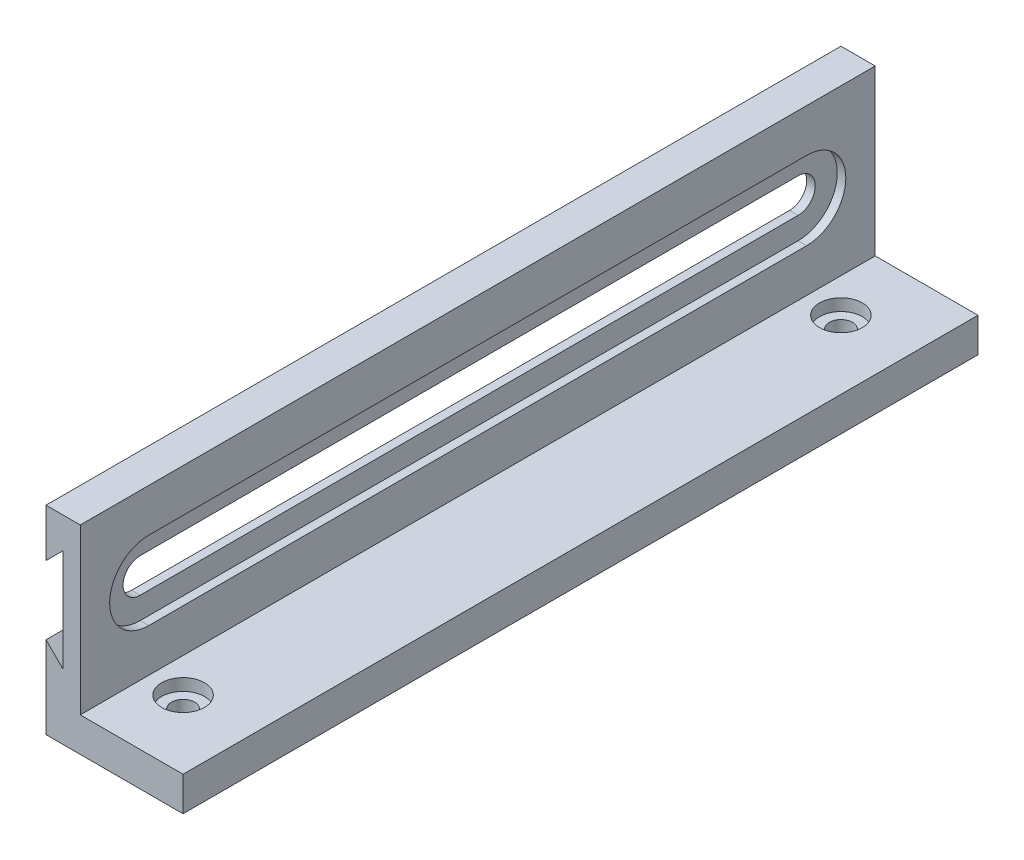
ISO-10303-21;
HEADER;
FILE_DESCRIPTION(('STEP AP214'),'2;1');
FILE_NAME('part.step','',(''),(''),'','','');
FILE_SCHEMA(('AUTOMOTIVE_DESIGN { 1 0 10303 214 1 1 1 1 }'));
ENDSEC;
DATA;
#1=APPLICATION_CONTEXT('core data for automotive mechanical design processes');
#2=APPLICATION_PROTOCOL_DEFINITION('international standard','automotive_design',2000,#1);
#3=PRODUCT_CONTEXT('',#1,'mechanical');
#4=PRODUCT('Part','Part','',(#3));
#5=PRODUCT_RELATED_PRODUCT_CATEGORY('part','',(#4));
#6=PRODUCT_DEFINITION_FORMATION('','',#4);
#7=PRODUCT_DEFINITION_CONTEXT('part definition',#1,'design');
#8=PRODUCT_DEFINITION('design','',#6,#7);
#9=PRODUCT_DEFINITION_SHAPE('','',#8);
#10=(LENGTH_UNIT() NAMED_UNIT(*) SI_UNIT(.MILLI.,.METRE.));
#11=(NAMED_UNIT(*) PLANE_ANGLE_UNIT() SI_UNIT($,.RADIAN.));
#12=(NAMED_UNIT(*) SI_UNIT($,.STERADIAN.) SOLID_ANGLE_UNIT());
#13=UNCERTAINTY_MEASURE_WITH_UNIT(LENGTH_MEASURE(1.E-05),#10,'distance_accuracy_value','');
#14=(GEOMETRIC_REPRESENTATION_CONTEXT(3) GLOBAL_UNCERTAINTY_ASSIGNED_CONTEXT((#13)) GLOBAL_UNIT_ASSIGNED_CONTEXT((#10,
#11,#12)) REPRESENTATION_CONTEXT('',''));
#15=CARTESIAN_POINT('',(0.,0.,0.));
#16=DIRECTION('',(0.,0.,1.));
#17=DIRECTION('',(1.,0.,0.));
#18=AXIS2_PLACEMENT_3D('',#15,#16,#17);
#19=CARTESIAN_POINT('',(0.,-6.35,0.));
#20=DIRECTION('',(-1.,0.,0.));
#21=DIRECTION('',(0.,0.,1.));
#22=AXIS2_PLACEMENT_3D('',#19,#20,#21);
#23=PLANE('',#22);
#24=DIRECTION('',(0.,1.,0.));
#25=VECTOR('',#24,1.);
#26=CARTESIAN_POINT('',(0.,-6.35,-147.32));
#27=LINE('',#26,#25);
#28=CARTESIAN_POINT('',(0.,21.59,-147.32));
#29=VERTEX_POINT('',#28);
#30=CARTESIAN_POINT('',(0.,30.48,-147.32));
#31=VERTEX_POINT('',#30);
#32=EDGE_CURVE('E203',#29,#31,#27,.T.);
#33=ORIENTED_EDGE('',*,*,#32,.F.);
#34=DIRECTION('',(0.,0.,-1.));
#35=VECTOR('',#34,1.);
#36=CARTESIAN_POINT('',(0.,21.59,0.));
#37=LINE('',#36,#35);
#38=CARTESIAN_POINT('',(0.,21.59,0.));
#39=VERTEX_POINT('',#38);
#40=EDGE_CURVE('E181',#39,#29,#37,.T.);
#41=ORIENTED_EDGE('',*,*,#40,.F.);
#42=DIRECTION('',(0.,1.,0.));
#43=VECTOR('',#42,1.);
#44=CARTESIAN_POINT('',(0.,-6.35,0.));
#45=LINE('',#44,#43);
#46=CARTESIAN_POINT('',(0.,30.48,0.));
#47=VERTEX_POINT('',#46);
#48=EDGE_CURVE('E196',#39,#47,#45,.T.);
#49=ORIENTED_EDGE('',*,*,#48,.T.);
#50=DIRECTION('',(0.,0.,-1.));
#51=VECTOR('',#50,1.);
#52=CARTESIAN_POINT('',(0.,30.48,0.));
#53=LINE('',#52,#51);
#54=EDGE_CURVE('E229',#47,#31,#53,.T.);
#55=ORIENTED_EDGE('',*,*,#54,.T.);
#56=EDGE_LOOP('',(#33,#41,#49,#55));
#57=FACE_BOUND('',#56,.T.);
#58=ADVANCED_FACE('F47',(#57),#23,.T.);
#59=CARTESIAN_POINT('',(0.,15.24,-12.7));
#60=DIRECTION('',(1.,0.,0.));
#61=DIRECTION('',(0.,0.,-1.));
#62=AXIS2_PLACEMENT_3D('',#59,#60,#61);
#63=CYLINDRICAL_SURFACE('',#62,3.175);
#64=DIRECTION('',(1.,0.,0.));
#65=VECTOR('',#64,1.);
#66=CARTESIAN_POINT('',(0.,12.065,-12.7));
#67=LINE('',#66,#65);
#68=CARTESIAN_POINT('',(3.17500000000001,12.065,-12.7));
#69=VERTEX_POINT('',#68);
#70=CARTESIAN_POINT('',(4.7625,12.065,-12.7));
#71=VERTEX_POINT('',#70);
#72=EDGE_CURVE('E268',#69,#71,#67,.T.);
#73=ORIENTED_EDGE('',*,*,#72,.F.);
#74=CARTESIAN_POINT('',(3.17500000000001,15.24,-12.7));
#75=DIRECTION('',(1.,0.,0.));
#76=DIRECTION('',(0.,1.,0.));
#77=AXIS2_PLACEMENT_3D('',#74,#75,#76);
#78=CIRCLE('',#77,3.175);
#79=CARTESIAN_POINT('',(3.17500000000001,18.415,-12.7));
#80=VERTEX_POINT('',#79);
#81=EDGE_CURVE('E62',#69,#80,#78,.F.);
#82=ORIENTED_EDGE('',*,*,#81,.T.);
#83=DIRECTION('',(1.,0.,0.));
#84=VECTOR('',#83,1.);
#85=CARTESIAN_POINT('',(0.,18.415,-12.7));
#86=LINE('',#85,#84);
#87=CARTESIAN_POINT('',(4.7625,18.415,-12.7));
#88=VERTEX_POINT('',#87);
#89=EDGE_CURVE('E267',#80,#88,#86,.T.);
#90=ORIENTED_EDGE('',*,*,#89,.T.);
#91=CARTESIAN_POINT('',(4.7625,15.24,-12.7));
#92=DIRECTION('',(1.,0.,0.));
#93=DIRECTION('',(0.,0.,-1.));
#94=AXIS2_PLACEMENT_3D('',#91,#92,#93);
#95=CIRCLE('',#94,3.175);
#96=EDGE_CURVE('E271',#71,#88,#95,.F.);
#97=ORIENTED_EDGE('',*,*,#96,.F.);
#98=EDGE_LOOP('',(#73,#82,#90,#97));
#99=FACE_BOUND('',#98,.T.);
#100=ADVANCED_FACE('F378',(#99),#63,.F.);
#101=CARTESIAN_POINT('',(0.,18.415,-12.7));
#102=DIRECTION('',(0.,-1.,0.));
#103=DIRECTION('',(0.,0.,-1.));
#104=AXIS2_PLACEMENT_3D('',#101,#102,#103);
#105=PLANE('',#104);
#106=DIRECTION('',(0.,0.,1.));
#107=VECTOR('',#106,1.);
#108=CARTESIAN_POINT('',(3.17500000000001,18.415,-12.7));
#109=LINE('',#108,#107);
#110=CARTESIAN_POINT('',(3.17500000000001,18.415,-134.62));
#111=VERTEX_POINT('',#110);
#112=EDGE_CURVE('E317',#111,#80,#109,.T.);
#113=ORIENTED_EDGE('',*,*,#112,.F.);
#114=DIRECTION('',(1.,0.,0.));
#115=VECTOR('',#114,1.);
#116=CARTESIAN_POINT('',(0.,18.415,-134.62));
#117=LINE('',#116,#115);
#118=CARTESIAN_POINT('',(4.7625,18.415,-134.62));
#119=VERTEX_POINT('',#118);
#120=EDGE_CURVE('E273',#111,#119,#117,.T.);
#121=ORIENTED_EDGE('',*,*,#120,.T.);
#122=DIRECTION('',(0.,0.,1.));
#123=VECTOR('',#122,1.);
#124=CARTESIAN_POINT('',(4.7625,18.415,-12.7));
#125=LINE('',#124,#123);
#126=EDGE_CURVE('E278',#119,#88,#125,.T.);
#127=ORIENTED_EDGE('',*,*,#126,.T.);
#128=ORIENTED_EDGE('',*,*,#89,.F.);
#129=EDGE_LOOP('',(#113,#121,#127,#128));
#130=FACE_BOUND('',#129,.T.);
#131=ADVANCED_FACE('F383',(#130),#105,.T.);
#132=CARTESIAN_POINT('',(0.,15.24,-134.62));
#133=DIRECTION('',(1.,0.,0.));
#134=DIRECTION('',(0.,0.,-1.));
#135=AXIS2_PLACEMENT_3D('',#132,#133,#134);
#136=CYLINDRICAL_SURFACE('',#135,3.175);
#137=ORIENTED_EDGE('',*,*,#120,.F.);
#138=CARTESIAN_POINT('',(3.17500000000001,15.24,-134.62));
#139=DIRECTION('',(1.,0.,0.));
#140=DIRECTION('',(0.,1.,0.));
#141=AXIS2_PLACEMENT_3D('',#138,#139,#140);
#142=CIRCLE('',#141,3.175);
#143=CARTESIAN_POINT('',(3.17500000000001,12.065,-134.62));
#144=VERTEX_POINT('',#143);
#145=EDGE_CURVE('E319',#111,#144,#142,.F.);
#146=ORIENTED_EDGE('',*,*,#145,.T.);
#147=DIRECTION('',(1.,0.,0.));
#148=VECTOR('',#147,1.);
#149=CARTESIAN_POINT('',(0.,12.065,-134.62));
#150=LINE('',#149,#148);
#151=CARTESIAN_POINT('',(4.7625,12.065,-134.62));
#152=VERTEX_POINT('',#151);
#153=EDGE_CURVE('E270',#144,#152,#150,.T.);
#154=ORIENTED_EDGE('',*,*,#153,.T.);
#155=CARTESIAN_POINT('',(4.7625,15.24,-134.62));
#156=DIRECTION('',(1.,0.,0.));
#157=DIRECTION('',(0.,0.,-1.));
#158=AXIS2_PLACEMENT_3D('',#155,#156,#157);
#159=CIRCLE('',#158,3.175);
#160=EDGE_CURVE('E281',#119,#152,#159,.F.);
#161=ORIENTED_EDGE('',*,*,#160,.F.);
#162=EDGE_LOOP('',(#137,#146,#154,#161));
#163=FACE_BOUND('',#162,.T.);
#164=ADVANCED_FACE('F392',(#163),#136,.F.);
#165=CARTESIAN_POINT('',(0.,12.065,-12.7));
#166=DIRECTION('',(0.,-1.,0.));
#167=DIRECTION('',(0.,0.,-1.));
#168=AXIS2_PLACEMENT_3D('',#165,#166,#167);
#169=PLANE('',#168);
#170=ORIENTED_EDGE('',*,*,#153,.F.);
#171=DIRECTION('',(0.,0.,1.));
#172=VECTOR('',#171,1.);
#173=CARTESIAN_POINT('',(3.17500000000001,12.065,-12.7));
#174=LINE('',#173,#172);
#175=EDGE_CURVE('E322',#144,#69,#174,.T.);
#176=ORIENTED_EDGE('',*,*,#175,.T.);
#177=ORIENTED_EDGE('',*,*,#72,.T.);
#178=DIRECTION('',(0.,0.,1.));
#179=VECTOR('',#178,1.);
#180=CARTESIAN_POINT('',(4.7625,12.065,-12.7));
#181=LINE('',#180,#179);
#182=EDGE_CURVE('E11',#152,#71,#181,.T.);
#183=ORIENTED_EDGE('',*,*,#182,.F.);
#184=EDGE_LOOP('',(#170,#176,#177,#183));
#185=FACE_BOUND('',#184,.T.);
#186=ADVANCED_FACE('F387',(#185),#169,.F.);
#187=DIRECTION('',(0.,0.,-1.));
#188=VECTOR('',#187,1.);
#189=CARTESIAN_POINT('',(0.,8.89,0.));
#190=LINE('',#189,#188);
#191=CARTESIAN_POINT('',(0.,8.89,0.));
#192=VERTEX_POINT('',#191);
#193=CARTESIAN_POINT('',(0.,8.89,-147.32));
#194=VERTEX_POINT('',#193);
#195=EDGE_CURVE('E172',#192,#194,#190,.T.);
#196=ORIENTED_EDGE('',*,*,#195,.T.);
#197=CARTESIAN_POINT('',(0.,-6.35,-147.32));
#198=VERTEX_POINT('',#197);
#199=EDGE_CURVE('E55',#198,#194,#27,.T.);
#200=ORIENTED_EDGE('',*,*,#199,.F.);
#201=DIRECTION('',(0.,0.,1.));
#202=VECTOR('',#201,1.);
#203=CARTESIAN_POINT('',(0.,-6.35,0.));
#204=LINE('',#203,#202);
#205=CARTESIAN_POINT('',(0.,-6.35,0.));
#206=VERTEX_POINT('',#205);
#207=EDGE_CURVE('E194',#198,#206,#204,.T.);
#208=ORIENTED_EDGE('',*,*,#207,.T.);
#209=EDGE_CURVE('E186',#206,#192,#45,.T.);
#210=ORIENTED_EDGE('',*,*,#209,.T.);
#211=EDGE_LOOP('',(#196,#200,#208,#210));
#212=FACE_BOUND('',#211,.T.);
#213=ADVANCED_FACE('F49',(#212),#23,.T.);
#214=CARTESIAN_POINT('',(0.,-6.35,-147.32));
#215=DIRECTION('',(0.,0.,-1.));
#216=DIRECTION('',(-1.,0.,0.));
#217=AXIS2_PLACEMENT_3D('',#214,#215,#216);
#218=PLANE('',#217);
#219=DIRECTION('',(-0.707106781186544,0.707106781186551,0.));
#220=VECTOR('',#219,1.);
#221=CARTESIAN_POINT('',(3.17500000000001,5.71499999999997,-147.32));
#222=LINE('',#221,#220);
#223=CARTESIAN_POINT('',(3.17500000000001,5.71499999999997,-147.32));
#224=VERTEX_POINT('',#223);
#225=EDGE_CURVE('E177',#224,#194,#222,.T.);
#226=ORIENTED_EDGE('',*,*,#225,.F.);
#227=DIRECTION('',(0.,-1.,0.));
#228=VECTOR('',#227,1.);
#229=CARTESIAN_POINT('',(3.17500000000001,24.765,-147.32));
#230=LINE('',#229,#228);
#231=CARTESIAN_POINT('',(3.17500000000001,24.765,-147.32));
#232=VERTEX_POINT('',#231);
#233=EDGE_CURVE('E190',#232,#224,#230,.T.);
#234=ORIENTED_EDGE('',*,*,#233,.F.);
#235=DIRECTION('',(-0.707106781186549,-0.707106781186546,0.));
#236=VECTOR('',#235,1.);
#237=CARTESIAN_POINT('',(3.17500000000001,24.765,-147.32));
#238=LINE('',#237,#236);
#239=EDGE_CURVE('E332',#232,#29,#238,.T.);
#240=ORIENTED_EDGE('',*,*,#239,.T.);
#241=ORIENTED_EDGE('',*,*,#32,.T.);
#242=DIRECTION('',(-1.,0.,0.));
#243=VECTOR('',#242,1.);
#244=CARTESIAN_POINT('',(6.35,30.48,-147.32));
#245=LINE('',#244,#243);
#246=CARTESIAN_POINT('',(6.35,30.48,-147.32));
#247=VERTEX_POINT('',#246);
#248=EDGE_CURVE('E213',#247,#31,#245,.T.);
#249=ORIENTED_EDGE('',*,*,#248,.F.);
#250=DIRECTION('',(0.,-1.,0.));
#251=VECTOR('',#250,1.);
#252=CARTESIAN_POINT('',(6.35,0.,-147.32));
#253=LINE('',#252,#251);
#254=CARTESIAN_POINT('',(6.35,0.,-147.32));
#255=VERTEX_POINT('',#254);
#256=EDGE_CURVE('E237',#247,#255,#253,.T.);
#257=ORIENTED_EDGE('',*,*,#256,.T.);
#258=DIRECTION('',(-1.,0.,0.));
#259=VECTOR('',#258,1.);
#260=CARTESIAN_POINT('',(0.,0.,-147.32));
#261=LINE('',#260,#259);
#262=CARTESIAN_POINT('',(25.4,0.,-147.32));
#263=VERTEX_POINT('',#262);
#264=EDGE_CURVE('E205',#263,#255,#261,.T.);
#265=ORIENTED_EDGE('',*,*,#264,.F.);
#266=DIRECTION('',(0.,1.,0.));
#267=VECTOR('',#266,1.);
#268=CARTESIAN_POINT('',(25.4,-6.35,-147.32));
#269=LINE('',#268,#267);
#270=CARTESIAN_POINT('',(25.4,-6.35,-147.32));
#271=VERTEX_POINT('',#270);
#272=EDGE_CURVE('E198',#271,#263,#269,.T.);
#273=ORIENTED_EDGE('',*,*,#272,.F.);
#274=DIRECTION('',(-1.,0.,0.));
#275=VECTOR('',#274,1.);
#276=CARTESIAN_POINT('',(0.,-6.35,-147.32));
#277=LINE('',#276,#275);
#278=EDGE_CURVE('E200',#271,#198,#277,.T.);
#279=ORIENTED_EDGE('',*,*,#278,.T.);
#280=ORIENTED_EDGE('',*,*,#199,.T.);
#281=EDGE_LOOP('',(#226,#234,#240,#241,#249,#257,#265,#273,#279,#280));
#282=FACE_BOUND('',#281,.T.);
#283=ADVANCED_FACE('F351',(#282),#218,.T.);
#284=CARTESIAN_POINT('',(25.4,-6.35,0.));
#285=DIRECTION('',(1.,0.,0.));
#286=DIRECTION('',(0.,0.,-1.));
#287=AXIS2_PLACEMENT_3D('',#284,#285,#286);
#288=PLANE('',#287);
#289=DIRECTION('',(0.,0.,-1.));
#290=VECTOR('',#289,1.);
#291=CARTESIAN_POINT('',(25.4,0.,0.));
#292=LINE('',#291,#290);
#293=CARTESIAN_POINT('',(25.4,0.,0.));
#294=VERTEX_POINT('',#293);
#295=EDGE_CURVE('E208',#294,#263,#292,.T.);
#296=ORIENTED_EDGE('',*,*,#295,.F.);
#297=DIRECTION('',(0.,1.,0.));
#298=VECTOR('',#297,1.);
#299=CARTESIAN_POINT('',(25.4,-6.35,0.));
#300=LINE('',#299,#298);
#301=CARTESIAN_POINT('',(25.4,-6.35,0.));
#302=VERTEX_POINT('',#301);
#303=EDGE_CURVE('E195',#302,#294,#300,.T.);
#304=ORIENTED_EDGE('',*,*,#303,.F.);
#305=DIRECTION('',(0.,0.,-1.));
#306=VECTOR('',#305,1.);
#307=CARTESIAN_POINT('',(25.4,-6.35,0.));
#308=LINE('',#307,#306);
#309=EDGE_CURVE('E216',#302,#271,#308,.T.);
#310=ORIENTED_EDGE('',*,*,#309,.T.);
#311=ORIENTED_EDGE('',*,*,#272,.T.);
#312=EDGE_LOOP('',(#296,#304,#310,#311));
#313=FACE_BOUND('',#312,.T.);
#314=ADVANCED_FACE('F362',(#313),#288,.T.);
#315=CARTESIAN_POINT('',(0.,-6.35,0.));
#316=DIRECTION('',(0.,0.,1.));
#317=DIRECTION('',(1.,0.,0.));
#318=AXIS2_PLACEMENT_3D('',#315,#316,#317);
#319=PLANE('',#318);
#320=DIRECTION('',(-0.707106781186544,0.707106781186551,0.));
#321=VECTOR('',#320,1.);
#322=CARTESIAN_POINT('',(3.17500000000001,5.71499999999997,0.));
#323=LINE('',#322,#321);
#324=CARTESIAN_POINT('',(3.17500000000001,5.71499999999997,0.));
#325=VERTEX_POINT('',#324);
#326=EDGE_CURVE('E175',#325,#192,#323,.T.);
#327=ORIENTED_EDGE('',*,*,#326,.T.);
#328=ORIENTED_EDGE('',*,*,#209,.F.);
#329=DIRECTION('',(1.,0.,0.));
#330=VECTOR('',#329,1.);
#331=CARTESIAN_POINT('',(0.,-6.35,0.));
#332=LINE('',#331,#330);
#333=EDGE_CURVE('E219',#206,#302,#332,.T.);
#334=ORIENTED_EDGE('',*,*,#333,.T.);
#335=ORIENTED_EDGE('',*,*,#303,.T.);
#336=DIRECTION('',(1.,0.,0.));
#337=VECTOR('',#336,1.);
#338=CARTESIAN_POINT('',(0.,0.,0.));
#339=LINE('',#338,#337);
#340=CARTESIAN_POINT('',(6.35,0.,0.));
#341=VERTEX_POINT('',#340);
#342=EDGE_CURVE('E211',#341,#294,#339,.T.);
#343=ORIENTED_EDGE('',*,*,#342,.F.);
#344=DIRECTION('',(0.,1.,0.));
#345=VECTOR('',#344,1.);
#346=CARTESIAN_POINT('',(6.35,0.,0.));
#347=LINE('',#346,#345);
#348=CARTESIAN_POINT('',(6.35,30.48,0.));
#349=VERTEX_POINT('',#348);
#350=EDGE_CURVE('E232',#341,#349,#347,.T.);
#351=ORIENTED_EDGE('',*,*,#350,.T.);
#352=DIRECTION('',(-1.,0.,0.));
#353=VECTOR('',#352,1.);
#354=CARTESIAN_POINT('',(6.35,30.48,0.));
#355=LINE('',#354,#353);
#356=EDGE_CURVE('E223',#349,#47,#355,.T.);
#357=ORIENTED_EDGE('',*,*,#356,.T.);
#358=ORIENTED_EDGE('',*,*,#48,.F.);
#359=DIRECTION('',(-0.707106781186549,-0.707106781186546,0.));
#360=VECTOR('',#359,1.);
#361=CARTESIAN_POINT('',(3.17500000000001,24.765,0.));
#362=LINE('',#361,#360);
#363=CARTESIAN_POINT('',(3.17500000000001,24.765,0.));
#364=VERTEX_POINT('',#363);
#365=EDGE_CURVE('E189',#364,#39,#362,.T.);
#366=ORIENTED_EDGE('',*,*,#365,.F.);
#367=DIRECTION('',(0.,-1.,0.));
#368=VECTOR('',#367,1.);
#369=CARTESIAN_POINT('',(3.17500000000001,24.765,0.));
#370=LINE('',#369,#368);
#371=EDGE_CURVE('E70',#364,#325,#370,.T.);
#372=ORIENTED_EDGE('',*,*,#371,.T.);
#373=EDGE_LOOP('',(#327,#328,#334,#335,#343,#351,#357,#358,#366,#372));
#374=FACE_BOUND('',#373,.T.);
#375=ADVANCED_FACE('F184',(#374),#319,.T.);
#376=CARTESIAN_POINT('',(0.,-6.35,0.));
#377=DIRECTION('',(0.,-1.,0.));
#378=DIRECTION('',(0.,0.,-1.));
#379=AXIS2_PLACEMENT_3D('',#376,#377,#378);
#380=PLANE('',#379);
#381=CARTESIAN_POINT('',(12.7,-6.35,-12.7));
#382=DIRECTION('',(0.,-1.,0.));
#383=DIRECTION('',(0.,0.,-1.));
#384=AXIS2_PLACEMENT_3D('',#381,#382,#383);
#385=CIRCLE('',#384,2.15265000000002);
#386=CARTESIAN_POINT('',(12.7,-6.35,-14.85265));
#387=VERTEX_POINT('',#386);
#388=EDGE_CURVE('E255',#387,#387,#385,.T.);
#389=ORIENTED_EDGE('',*,*,#388,.F.);
#390=EDGE_LOOP('',(#389));
#391=FACE_BOUND('',#390,.T.);
#392=CARTESIAN_POINT('',(12.7,-6.35,-134.62));
#393=DIRECTION('',(0.,-1.,0.));
#394=DIRECTION('',(0.,0.,-1.));
#395=AXIS2_PLACEMENT_3D('',#392,#393,#394);
#396=CIRCLE('',#395,2.15265000000002);
#397=CARTESIAN_POINT('',(12.7,-6.35,-136.77265));
#398=VERTEX_POINT('',#397);
#399=EDGE_CURVE('E233',#398,#398,#396,.T.);
#400=ORIENTED_EDGE('',*,*,#399,.F.);
#401=EDGE_LOOP('',(#400));
#402=FACE_BOUND('',#401,.T.);
#403=ORIENTED_EDGE('',*,*,#207,.F.);
#404=ORIENTED_EDGE('',*,*,#278,.F.);
#405=ORIENTED_EDGE('',*,*,#309,.F.);
#406=ORIENTED_EDGE('',*,*,#333,.F.);
#407=EDGE_LOOP('',(#403,#404,#405,#406));
#408=FACE_BOUND('',#407,.T.);
#409=ADVANCED_FACE('F364',(#391,#402,#408),#380,.T.);
#410=CARTESIAN_POINT('',(0.,0.,0.));
#411=DIRECTION('',(0.,-1.,0.));
#412=DIRECTION('',(0.,0.,-1.));
#413=AXIS2_PLACEMENT_3D('',#410,#411,#412);
#414=PLANE('',#413);
#415=CARTESIAN_POINT('',(12.7,0.,-12.7));
#416=DIRECTION('',(0.,1.,0.));
#417=DIRECTION('',(0.,0.,1.));
#418=AXIS2_PLACEMENT_3D('',#415,#416,#417);
#419=CIRCLE('',#418,3.96875);
#420=CARTESIAN_POINT('',(12.7,0.,-8.73125));
#421=VERTEX_POINT('',#420);
#422=EDGE_CURVE('E264',#421,#421,#419,.T.);
#423=ORIENTED_EDGE('',*,*,#422,.F.);
#424=EDGE_LOOP('',(#423));
#425=FACE_BOUND('',#424,.T.);
#426=CARTESIAN_POINT('',(12.7,0.,-134.62));
#427=DIRECTION('',(0.,1.,0.));
#428=DIRECTION('',(0.,0.,1.));
#429=AXIS2_PLACEMENT_3D('',#426,#427,#428);
#430=CIRCLE('',#429,3.96875);
#431=CARTESIAN_POINT('',(12.7,0.,-130.65125));
#432=VERTEX_POINT('',#431);
#433=EDGE_CURVE('E252',#432,#432,#430,.T.);
#434=ORIENTED_EDGE('',*,*,#433,.F.);
#435=EDGE_LOOP('',(#434));
#436=FACE_BOUND('',#435,.T.);
#437=ORIENTED_EDGE('',*,*,#264,.T.);
#438=DIRECTION('',(0.,0.,1.));
#439=VECTOR('',#438,1.);
#440=CARTESIAN_POINT('',(6.35,0.,0.));
#441=LINE('',#440,#439);
#442=EDGE_CURVE('E226',#255,#341,#441,.T.);
#443=ORIENTED_EDGE('',*,*,#442,.T.);
#444=ORIENTED_EDGE('',*,*,#342,.T.);
#445=ORIENTED_EDGE('',*,*,#295,.T.);
#446=EDGE_LOOP('',(#437,#443,#444,#445));
#447=FACE_BOUND('',#446,.T.);
#448=ADVANCED_FACE('F357',(#425,#436,#447),#414,.F.);
#449=CARTESIAN_POINT('',(6.35,30.48,0.));
#450=DIRECTION('',(0.,1.,0.));
#451=DIRECTION('',(0.,0.,1.));
#452=AXIS2_PLACEMENT_3D('',#449,#450,#451);
#453=PLANE('',#452);
#454=ORIENTED_EDGE('',*,*,#54,.F.);
#455=ORIENTED_EDGE('',*,*,#356,.F.);
#456=DIRECTION('',(0.,0.,-1.));
#457=VECTOR('',#456,1.);
#458=CARTESIAN_POINT('',(6.35,30.48,0.));
#459=LINE('',#458,#457);
#460=EDGE_CURVE('E239',#349,#247,#459,.T.);
#461=ORIENTED_EDGE('',*,*,#460,.T.);
#462=ORIENTED_EDGE('',*,*,#248,.T.);
#463=EDGE_LOOP('',(#454,#455,#461,#462));
#464=FACE_BOUND('',#463,.T.);
#465=ADVANCED_FACE('F348',(#464),#453,.T.);
#466=CARTESIAN_POINT('',(6.35,0.,0.));
#467=DIRECTION('',(-1.,0.,0.));
#468=DIRECTION('',(0.,0.,1.));
#469=AXIS2_PLACEMENT_3D('',#466,#467,#468);
#470=PLANE('',#469);
#471=DIRECTION('',(0.,0.,-1.));
#472=VECTOR('',#471,1.);
#473=CARTESIAN_POINT('',(6.35,7.98626799999999,-12.7));
#474=LINE('',#473,#472);
#475=CARTESIAN_POINT('',(6.35,7.98626799999999,-12.7));
#476=VERTEX_POINT('',#475);
#477=CARTESIAN_POINT('',(6.35,7.98626799999999,-134.62));
#478=VERTEX_POINT('',#477);
#479=EDGE_CURVE('E301',#476,#478,#474,.T.);
#480=ORIENTED_EDGE('',*,*,#479,.F.);
#481=CARTESIAN_POINT('',(6.35,15.24,-12.7));
#482=DIRECTION('',(1.,0.,0.));
#483=DIRECTION('',(0.,0.,-1.));
#484=AXIS2_PLACEMENT_3D('',#481,#482,#483);
#485=CIRCLE('',#484,7.253732);
#486=CARTESIAN_POINT('',(6.35,22.493732,-12.7));
#487=VERTEX_POINT('',#486);
#488=EDGE_CURVE('E304',#487,#476,#485,.T.);
#489=ORIENTED_EDGE('',*,*,#488,.F.);
#490=DIRECTION('',(0.,0.,1.));
#491=VECTOR('',#490,1.);
#492=CARTESIAN_POINT('',(6.35,22.493732,-12.7));
#493=LINE('',#492,#491);
#494=CARTESIAN_POINT('',(6.35,22.493732,-134.62));
#495=VERTEX_POINT('',#494);
#496=EDGE_CURVE('E294',#495,#487,#493,.T.);
#497=ORIENTED_EDGE('',*,*,#496,.F.);
#498=CARTESIAN_POINT('',(6.35,15.24,-134.62));
#499=DIRECTION('',(1.,0.,0.));
#500=DIRECTION('',(0.,0.,-1.));
#501=AXIS2_PLACEMENT_3D('',#498,#499,#500);
#502=CIRCLE('',#501,7.253732);
#503=EDGE_CURVE('E298',#478,#495,#502,.T.);
#504=ORIENTED_EDGE('',*,*,#503,.F.);
#505=EDGE_LOOP('',(#480,#489,#497,#504));
#506=FACE_BOUND('',#505,.T.);
#507=ORIENTED_EDGE('',*,*,#350,.F.);
#508=ORIENTED_EDGE('',*,*,#442,.F.);
#509=ORIENTED_EDGE('',*,*,#256,.F.);
#510=ORIENTED_EDGE('',*,*,#460,.F.);
#511=EDGE_LOOP('',(#507,#508,#509,#510));
#512=FACE_BOUND('',#511,.T.);
#513=ADVANCED_FACE('F355',(#506,#512),#470,.F.);
#514=CARTESIAN_POINT('',(12.7,0.,-134.62));
#515=DIRECTION('',(0.,1.,0.));
#516=DIRECTION('',(0.,0.,1.));
#517=AXIS2_PLACEMENT_3D('',#514,#515,#516);
#518=CYLINDRICAL_SURFACE('',#517,2.15265000000002);
#519=CARTESIAN_POINT('',(12.7,-2.2098,-134.62));
#520=DIRECTION('',(0.,1.,0.));
#521=DIRECTION('',(0.,0.,1.));
#522=AXIS2_PLACEMENT_3D('',#519,#520,#521);
#523=CIRCLE('',#522,2.15265000000004);
#524=CARTESIAN_POINT('',(12.7,-2.2098,-132.46735));
#525=VERTEX_POINT('',#524);
#526=EDGE_CURVE('E246',#525,#525,#523,.T.);
#527=ORIENTED_EDGE('',*,*,#526,.T.);
#528=EDGE_LOOP('',(#527));
#529=FACE_BOUND('',#528,.T.);
#530=ORIENTED_EDGE('',*,*,#399,.T.);
#531=EDGE_LOOP('',(#530));
#532=FACE_BOUND('',#531,.T.);
#533=ADVANCED_FACE('F423',(#529,#532),#518,.F.);
#534=CARTESIAN_POINT('',(14.85265,-2.2098,-134.62));
#535=DIRECTION('',(0.,-1.,0.));
#536=DIRECTION('',(0.,0.,-1.));
#537=AXIS2_PLACEMENT_3D('',#534,#535,#536);
#538=PLANE('',#537);
#539=ORIENTED_EDGE('',*,*,#526,.F.);
#540=EDGE_LOOP('',(#539));
#541=FACE_BOUND('',#540,.T.);
#542=CARTESIAN_POINT('',(12.7,-2.2098,-134.62));
#543=DIRECTION('',(0.,1.,0.));
#544=DIRECTION('',(0.,0.,1.));
#545=AXIS2_PLACEMENT_3D('',#542,#543,#544);
#546=CIRCLE('',#545,3.96875);
#547=CARTESIAN_POINT('',(12.7,-2.2098,-130.65125));
#548=VERTEX_POINT('',#547);
#549=EDGE_CURVE('E249',#548,#548,#546,.T.);
#550=ORIENTED_EDGE('',*,*,#549,.T.);
#551=EDGE_LOOP('',(#550));
#552=FACE_BOUND('',#551,.T.);
#553=ADVANCED_FACE('F419',(#541,#552),#538,.F.);
#554=CARTESIAN_POINT('',(12.7,0.,-134.62));
#555=DIRECTION('',(0.,1.,0.));
#556=DIRECTION('',(0.,0.,1.));
#557=AXIS2_PLACEMENT_3D('',#554,#555,#556);
#558=CYLINDRICAL_SURFACE('',#557,3.96875);
#559=ORIENTED_EDGE('',*,*,#549,.F.);
#560=EDGE_LOOP('',(#559));
#561=FACE_BOUND('',#560,.T.);
#562=ORIENTED_EDGE('',*,*,#433,.T.);
#563=EDGE_LOOP('',(#562));
#564=FACE_BOUND('',#563,.T.);
#565=ADVANCED_FACE('F415',(#561,#564),#558,.F.);
#566=CARTESIAN_POINT('',(12.7,0.,-12.7));
#567=DIRECTION('',(0.,1.,0.));
#568=DIRECTION('',(0.,0.,1.));
#569=AXIS2_PLACEMENT_3D('',#566,#567,#568);
#570=CYLINDRICAL_SURFACE('',#569,2.15265000000002);
#571=CARTESIAN_POINT('',(12.7,-2.2098,-12.7));
#572=DIRECTION('',(0.,1.,0.));
#573=DIRECTION('',(0.,0.,1.));
#574=AXIS2_PLACEMENT_3D('',#571,#572,#573);
#575=CIRCLE('',#574,2.15265000000004);
#576=CARTESIAN_POINT('',(12.7,-2.2098,-10.54735));
#577=VERTEX_POINT('',#576);
#578=EDGE_CURVE('E258',#577,#577,#575,.T.);
#579=ORIENTED_EDGE('',*,*,#578,.T.);
#580=EDGE_LOOP('',(#579));
#581=FACE_BOUND('',#580,.T.);
#582=ORIENTED_EDGE('',*,*,#388,.T.);
#583=EDGE_LOOP('',(#582));
#584=FACE_BOUND('',#583,.T.);
#585=ADVANCED_FACE('F411',(#581,#584),#570,.F.);
#586=CARTESIAN_POINT('',(14.85265,-2.2098,-12.7));
#587=DIRECTION('',(0.,-1.,0.));
#588=DIRECTION('',(0.,0.,-1.));
#589=AXIS2_PLACEMENT_3D('',#586,#587,#588);
#590=PLANE('',#589);
#591=ORIENTED_EDGE('',*,*,#578,.F.);
#592=EDGE_LOOP('',(#591));
#593=FACE_BOUND('',#592,.T.);
#594=CARTESIAN_POINT('',(12.7,-2.2098,-12.7));
#595=DIRECTION('',(0.,1.,0.));
#596=DIRECTION('',(0.,0.,1.));
#597=AXIS2_PLACEMENT_3D('',#594,#595,#596);
#598=CIRCLE('',#597,3.96875);
#599=CARTESIAN_POINT('',(12.7,-2.2098,-8.73125));
#600=VERTEX_POINT('',#599);
#601=EDGE_CURVE('E261',#600,#600,#598,.T.);
#602=ORIENTED_EDGE('',*,*,#601,.T.);
#603=EDGE_LOOP('',(#602));
#604=FACE_BOUND('',#603,.T.);
#605=ADVANCED_FACE('F407',(#593,#604),#590,.F.);
#606=CARTESIAN_POINT('',(12.7,0.,-12.7));
#607=DIRECTION('',(0.,1.,0.));
#608=DIRECTION('',(0.,0.,1.));
#609=AXIS2_PLACEMENT_3D('',#606,#607,#608);
#610=CYLINDRICAL_SURFACE('',#609,3.96875);
#611=ORIENTED_EDGE('',*,*,#601,.F.);
#612=EDGE_LOOP('',(#611));
#613=FACE_BOUND('',#612,.T.);
#614=ORIENTED_EDGE('',*,*,#422,.T.);
#615=EDGE_LOOP('',(#614));
#616=FACE_BOUND('',#615,.T.);
#617=ADVANCED_FACE('F403',(#613,#616),#610,.F.);
#618=CARTESIAN_POINT('',(4.7625,15.24,-12.7));
#619=DIRECTION('',(1.,0.,0.));
#620=DIRECTION('',(0.,0.,-1.));
#621=AXIS2_PLACEMENT_3D('',#618,#619,#620);
#622=PLANE('',#621);
#623=CARTESIAN_POINT('',(4.7625,15.24,-12.7));
#624=DIRECTION('',(1.,0.,0.));
#625=DIRECTION('',(0.,0.,-1.));
#626=AXIS2_PLACEMENT_3D('',#623,#624,#625);
#627=CIRCLE('',#626,7.253732);
#628=CARTESIAN_POINT('',(4.7625,22.493732,-12.7));
#629=VERTEX_POINT('',#628);
#630=CARTESIAN_POINT('',(4.7625,7.98626799999999,-12.7));
#631=VERTEX_POINT('',#630);
#632=EDGE_CURVE('E297',#629,#631,#627,.T.);
#633=ORIENTED_EDGE('',*,*,#632,.T.);
#634=DIRECTION('',(0.,0.,-1.));
#635=VECTOR('',#634,1.);
#636=CARTESIAN_POINT('',(4.7625,7.98626799999999,-12.7));
#637=LINE('',#636,#635);
#638=CARTESIAN_POINT('',(4.7625,7.98626799999999,-134.62));
#639=VERTEX_POINT('',#638);
#640=EDGE_CURVE('E311',#631,#639,#637,.T.);
#641=ORIENTED_EDGE('',*,*,#640,.T.);
#642=CARTESIAN_POINT('',(4.7625,15.24,-134.62));
#643=DIRECTION('',(1.,0.,0.));
#644=DIRECTION('',(0.,0.,-1.));
#645=AXIS2_PLACEMENT_3D('',#642,#643,#644);
#646=CIRCLE('',#645,7.253732);
#647=CARTESIAN_POINT('',(4.7625,22.493732,-134.62));
#648=VERTEX_POINT('',#647);
#649=EDGE_CURVE('E308',#639,#648,#646,.T.);
#650=ORIENTED_EDGE('',*,*,#649,.T.);
#651=DIRECTION('',(0.,0.,1.));
#652=VECTOR('',#651,1.);
#653=CARTESIAN_POINT('',(4.7625,22.493732,-12.7));
#654=LINE('',#653,#652);
#655=EDGE_CURVE('E289',#648,#629,#654,.T.);
#656=ORIENTED_EDGE('',*,*,#655,.T.);
#657=EDGE_LOOP('',(#633,#641,#650,#656));
#658=FACE_BOUND('',#657,.T.);
#659=ORIENTED_EDGE('',*,*,#96,.T.);
#660=ORIENTED_EDGE('',*,*,#126,.F.);
#661=ORIENTED_EDGE('',*,*,#160,.T.);
#662=ORIENTED_EDGE('',*,*,#182,.T.);
#663=EDGE_LOOP('',(#659,#660,#661,#662));
#664=FACE_BOUND('',#663,.T.);
#665=ADVANCED_FACE('F406',(#658,#664),#622,.T.);
#666=CARTESIAN_POINT('',(4.7625,15.24,-12.7));
#667=DIRECTION('',(1.,0.,0.));
#668=DIRECTION('',(0.,0.,-1.));
#669=AXIS2_PLACEMENT_3D('',#666,#667,#668);
#670=CYLINDRICAL_SURFACE('',#669,7.253732);
#671=ORIENTED_EDGE('',*,*,#488,.T.);
#672=DIRECTION('',(1.,0.,0.));
#673=VECTOR('',#672,1.);
#674=CARTESIAN_POINT('',(4.7625,7.98626799999999,-12.7));
#675=LINE('',#674,#673);
#676=EDGE_CURVE('E285',#631,#476,#675,.T.);
#677=ORIENTED_EDGE('',*,*,#676,.F.);
#678=ORIENTED_EDGE('',*,*,#632,.F.);
#679=DIRECTION('',(1.,0.,0.));
#680=VECTOR('',#679,1.);
#681=CARTESIAN_POINT('',(4.7625,22.493732,-12.7));
#682=LINE('',#681,#680);
#683=EDGE_CURVE('E284',#629,#487,#682,.T.);
#684=ORIENTED_EDGE('',*,*,#683,.T.);
#685=EDGE_LOOP('',(#671,#677,#678,#684));
#686=FACE_BOUND('',#685,.T.);
#687=ADVANCED_FACE('F493',(#686),#670,.F.);
#688=CARTESIAN_POINT('',(4.7625,22.493732,-12.7));
#689=DIRECTION('',(0.,1.,0.));
#690=DIRECTION('',(0.,0.,1.));
#691=AXIS2_PLACEMENT_3D('',#688,#689,#690);
#692=PLANE('',#691);
#693=ORIENTED_EDGE('',*,*,#496,.T.);
#694=ORIENTED_EDGE('',*,*,#683,.F.);
#695=ORIENTED_EDGE('',*,*,#655,.F.);
#696=DIRECTION('',(1.,0.,0.));
#697=VECTOR('',#696,1.);
#698=CARTESIAN_POINT('',(4.7625,22.493732,-134.62));
#699=LINE('',#698,#697);
#700=EDGE_CURVE('E291',#648,#495,#699,.T.);
#701=ORIENTED_EDGE('',*,*,#700,.T.);
#702=EDGE_LOOP('',(#693,#694,#695,#701));
#703=FACE_BOUND('',#702,.T.);
#704=ADVANCED_FACE('F503',(#703),#692,.F.);
#705=CARTESIAN_POINT('',(4.7625,15.24,-134.62));
#706=DIRECTION('',(1.,0.,0.));
#707=DIRECTION('',(0.,0.,-1.));
#708=AXIS2_PLACEMENT_3D('',#705,#706,#707);
#709=CYLINDRICAL_SURFACE('',#708,7.253732);
#710=ORIENTED_EDGE('',*,*,#503,.T.);
#711=ORIENTED_EDGE('',*,*,#700,.F.);
#712=ORIENTED_EDGE('',*,*,#649,.F.);
#713=DIRECTION('',(1.,0.,0.));
#714=VECTOR('',#713,1.);
#715=CARTESIAN_POINT('',(4.7625,7.98626799999999,-134.62));
#716=LINE('',#715,#714);
#717=EDGE_CURVE('E288',#639,#478,#716,.T.);
#718=ORIENTED_EDGE('',*,*,#717,.T.);
#719=EDGE_LOOP('',(#710,#711,#712,#718));
#720=FACE_BOUND('',#719,.T.);
#721=ADVANCED_FACE('F512',(#720),#709,.F.);
#722=CARTESIAN_POINT('',(4.7625,7.98626799999999,-12.7));
#723=DIRECTION('',(0.,-1.,0.));
#724=DIRECTION('',(0.,0.,-1.));
#725=AXIS2_PLACEMENT_3D('',#722,#723,#724);
#726=PLANE('',#725);
#727=ORIENTED_EDGE('',*,*,#479,.T.);
#728=ORIENTED_EDGE('',*,*,#717,.F.);
#729=ORIENTED_EDGE('',*,*,#640,.F.);
#730=ORIENTED_EDGE('',*,*,#676,.T.);
#731=EDGE_LOOP('',(#727,#728,#729,#730));
#732=FACE_BOUND('',#731,.T.);
#733=ADVANCED_FACE('F520',(#732),#726,.F.);
#734=CARTESIAN_POINT('',(3.17500000000001,24.765,0.));
#735=DIRECTION('',(1.,0.,0.));
#736=DIRECTION('',(0.,1.,0.));
#737=AXIS2_PLACEMENT_3D('',#734,#735,#736);
#738=PLANE('',#737);
#739=ORIENTED_EDGE('',*,*,#233,.T.);
#740=DIRECTION('',(0.,0.,-1.));
#741=VECTOR('',#740,1.);
#742=CARTESIAN_POINT('',(3.17500000000001,5.71499999999997,0.));
#743=LINE('',#742,#741);
#744=EDGE_CURVE('E323',#325,#224,#743,.T.);
#745=ORIENTED_EDGE('',*,*,#744,.F.);
#746=ORIENTED_EDGE('',*,*,#371,.F.);
#747=DIRECTION('',(0.,0.,-1.));
#748=VECTOR('',#747,1.);
#749=CARTESIAN_POINT('',(3.17500000000001,24.765,0.));
#750=LINE('',#749,#748);
#751=EDGE_CURVE('E326',#364,#232,#750,.T.);
#752=ORIENTED_EDGE('',*,*,#751,.T.);
#753=EDGE_LOOP('',(#739,#745,#746,#752));
#754=FACE_BOUND('',#753,.T.);
#755=ORIENTED_EDGE('',*,*,#175,.F.);
#756=ORIENTED_EDGE('',*,*,#145,.F.);
#757=ORIENTED_EDGE('',*,*,#112,.T.);
#758=ORIENTED_EDGE('',*,*,#81,.F.);
#759=EDGE_LOOP('',(#755,#756,#757,#758));
#760=FACE_BOUND('',#759,.T.);
#761=ADVANCED_FACE('F528',(#754,#760),#738,.F.);
#762=CARTESIAN_POINT('',(3.17500000000001,5.71499999999997,0.));
#763=DIRECTION('',(-0.707106781186551,-0.707106781186544,0.));
#764=DIRECTION('',(0.707106781186544,-0.707106781186551,0.));
#765=AXIS2_PLACEMENT_3D('',#762,#763,#764);
#766=PLANE('',#765);
#767=ORIENTED_EDGE('',*,*,#225,.T.);
#768=ORIENTED_EDGE('',*,*,#195,.F.);
#769=ORIENTED_EDGE('',*,*,#326,.F.);
#770=ORIENTED_EDGE('',*,*,#744,.T.);
#771=EDGE_LOOP('',(#767,#768,#769,#770));
#772=FACE_BOUND('',#771,.T.);
#773=ADVANCED_FACE('F174',(#772),#766,.F.);
#774=CARTESIAN_POINT('',(3.17500000000001,24.765,0.));
#775=DIRECTION('',(0.707106781186546,-0.707106781186549,0.));
#776=DIRECTION('',(0.707106781186549,0.707106781186546,0.));
#777=AXIS2_PLACEMENT_3D('',#774,#775,#776);
#778=PLANE('',#777);
#779=ORIENTED_EDGE('',*,*,#239,.F.);
#780=ORIENTED_EDGE('',*,*,#751,.F.);
#781=ORIENTED_EDGE('',*,*,#365,.T.);
#782=ORIENTED_EDGE('',*,*,#40,.T.);
#783=EDGE_LOOP('',(#779,#780,#781,#782));
#784=FACE_BOUND('',#783,.T.);
#785=ADVANCED_FACE('F340',(#784),#778,.T.);
#786=CLOSED_SHELL('',(#58,#100,#131,#164,#186,#213,#283,#314,#375,#409,#448,#465,#513,#533,#553,
#565,#585,#605,#617,#665,#687,#704,#721,#733,#761,#773,#785));
#787=MANIFOLD_SOLID_BREP('B2',#786);
#788=ADVANCED_BREP_SHAPE_REPRESENTATION('',(#18,#787),#14);
#789=SHAPE_DEFINITION_REPRESENTATION(#9,#788);
ENDSEC;
END-ISO-10303-21;
